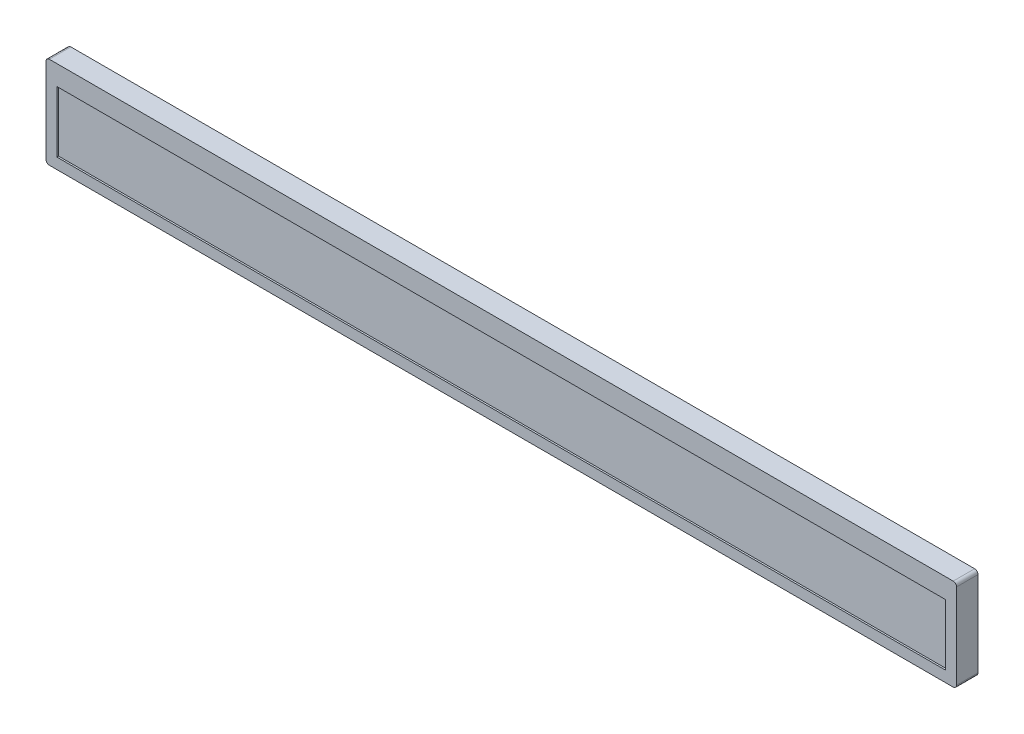
ISO-10303-21;
HEADER;
FILE_DESCRIPTION(('STEP AP214'),'2;1');
FILE_NAME('part.step','',(''),(''),'','','');
FILE_SCHEMA(('AUTOMOTIVE_DESIGN { 1 0 10303 214 1 1 1 1 }'));
ENDSEC;
DATA;
#1=APPLICATION_CONTEXT('core data for automotive mechanical design processes');
#2=APPLICATION_PROTOCOL_DEFINITION('international standard','automotive_design',2000,#1);
#3=PRODUCT_CONTEXT('',#1,'mechanical');
#4=PRODUCT('Part','Part','',(#3));
#5=PRODUCT_RELATED_PRODUCT_CATEGORY('part','',(#4));
#6=PRODUCT_DEFINITION_FORMATION('','',#4);
#7=PRODUCT_DEFINITION_CONTEXT('part definition',#1,'design');
#8=PRODUCT_DEFINITION('design','',#6,#7);
#9=PRODUCT_DEFINITION_SHAPE('','',#8);
#10=(LENGTH_UNIT() NAMED_UNIT(*) SI_UNIT(.MILLI.,.METRE.));
#11=(NAMED_UNIT(*) PLANE_ANGLE_UNIT() SI_UNIT($,.RADIAN.));
#12=(NAMED_UNIT(*) SI_UNIT($,.STERADIAN.) SOLID_ANGLE_UNIT());
#13=UNCERTAINTY_MEASURE_WITH_UNIT(LENGTH_MEASURE(1.E-05),#10,'distance_accuracy_value','');
#14=(GEOMETRIC_REPRESENTATION_CONTEXT(3) GLOBAL_UNCERTAINTY_ASSIGNED_CONTEXT((#13)) GLOBAL_UNIT_ASSIGNED_CONTEXT((#10,
#11,#12)) REPRESENTATION_CONTEXT('',''));
#15=CARTESIAN_POINT('',(0.,0.,0.));
#16=DIRECTION('',(0.,0.,1.));
#17=DIRECTION('',(1.,0.,0.));
#18=AXIS2_PLACEMENT_3D('',#15,#16,#17);
#19=CARTESIAN_POINT('',(269.21,25.35,0.));
#20=DIRECTION('',(0.,0.,-1.));
#21=DIRECTION('',(-1.,0.,0.));
#22=AXIS2_PLACEMENT_3D('',#19,#20,#21);
#23=PLANE('',#22);
#24=CARTESIAN_POINT('',(-253.41,4.02000000000001,0.));
#25=DIRECTION('',(0.,0.,-1.));
#26=DIRECTION('',(1.,0.,0.));
#27=AXIS2_PLACEMENT_3D('',#24,#25,#26);
#28=CIRCLE('',#27,2.50000000000002);
#29=CARTESIAN_POINT('',(-250.91,4.02000000000001,0.));
#30=VERTEX_POINT('',#29);
#31=EDGE_CURVE('E171',#30,#30,#28,.T.);
#32=ORIENTED_EDGE('',*,*,#31,.F.);
#33=EDGE_LOOP('',(#32));
#34=FACE_BOUND('',#33,.T.);
#35=CARTESIAN_POINT('',(-253.41,-10.06,0.));
#36=DIRECTION('',(0.,0.,-1.));
#37=DIRECTION('',(1.,0.,0.));
#38=AXIS2_PLACEMENT_3D('',#35,#36,#37);
#39=CIRCLE('',#38,2.50000000000002);
#40=CARTESIAN_POINT('',(-250.91,-10.06,0.));
#41=VERTEX_POINT('',#40);
#42=EDGE_CURVE('E180',#41,#41,#39,.T.);
#43=ORIENTED_EDGE('',*,*,#42,.F.);
#44=EDGE_LOOP('',(#43));
#45=FACE_BOUND('',#44,.T.);
#46=CARTESIAN_POINT('',(-113.,-10.06,0.));
#47=DIRECTION('',(0.,0.,-1.));
#48=DIRECTION('',(1.,0.,0.));
#49=AXIS2_PLACEMENT_3D('',#46,#47,#48);
#50=CIRCLE('',#49,2.5);
#51=CARTESIAN_POINT('',(-110.5,-10.06,0.));
#52=VERTEX_POINT('',#51);
#53=EDGE_CURVE('E185',#52,#52,#50,.T.);
#54=ORIENTED_EDGE('',*,*,#53,.F.);
#55=EDGE_LOOP('',(#54));
#56=FACE_BOUND('',#55,.T.);
#57=CARTESIAN_POINT('',(113.,-10.06,0.));
#58=DIRECTION('',(0.,0.,-1.));
#59=DIRECTION('',(-1.,0.,0.));
#60=AXIS2_PLACEMENT_3D('',#57,#58,#59);
#61=CIRCLE('',#60,2.5);
#62=CARTESIAN_POINT('',(110.5,-10.06,0.));
#63=VERTEX_POINT('',#62);
#64=EDGE_CURVE('E191',#63,#63,#61,.T.);
#65=ORIENTED_EDGE('',*,*,#64,.F.);
#66=EDGE_LOOP('',(#65));
#67=FACE_BOUND('',#66,.T.);
#68=CARTESIAN_POINT('',(253.41,-10.06,0.));
#69=DIRECTION('',(0.,0.,-1.));
#70=DIRECTION('',(-1.,0.,0.));
#71=AXIS2_PLACEMENT_3D('',#68,#69,#70);
#72=CIRCLE('',#71,2.50000000000002);
#73=CARTESIAN_POINT('',(250.91,-10.06,0.));
#74=VERTEX_POINT('',#73);
#75=EDGE_CURVE('E197',#74,#74,#72,.T.);
#76=ORIENTED_EDGE('',*,*,#75,.F.);
#77=EDGE_LOOP('',(#76));
#78=FACE_BOUND('',#77,.T.);
#79=CARTESIAN_POINT('',(253.41,4.02000000000001,0.));
#80=DIRECTION('',(0.,0.,-1.));
#81=DIRECTION('',(-1.,0.,0.));
#82=AXIS2_PLACEMENT_3D('',#79,#80,#81);
#83=CIRCLE('',#82,2.50000000000002);
#84=CARTESIAN_POINT('',(250.91,4.02000000000001,0.));
#85=VERTEX_POINT('',#84);
#86=EDGE_CURVE('E203',#85,#85,#83,.T.);
#87=ORIENTED_EDGE('',*,*,#86,.F.);
#88=EDGE_LOOP('',(#87));
#89=FACE_BOUND('',#88,.T.);
#90=DIRECTION('',(1.,0.,0.));
#91=VECTOR('',#90,1.);
#92=CARTESIAN_POINT('',(-269.21,-27.35,0.));
#93=LINE('',#92,#91);
#94=CARTESIAN_POINT('',(17.16,-27.35,0.));
#95=VERTEX_POINT('',#94);
#96=CARTESIAN_POINT('',(269.21,-27.35,0.));
#97=VERTEX_POINT('',#96);
#98=EDGE_CURVE('E271',#95,#97,#93,.T.);
#99=ORIENTED_EDGE('',*,*,#98,.F.);
#100=DIRECTION('',(0.,-1.,0.));
#101=VECTOR('',#100,1.);
#102=CARTESIAN_POINT('',(17.16,-12.47,0.));
#103=LINE('',#102,#101);
#104=CARTESIAN_POINT('',(17.16,-12.47,0.));
#105=VERTEX_POINT('',#104);
#106=EDGE_CURVE('E169',#105,#95,#103,.T.);
#107=ORIENTED_EDGE('',*,*,#106,.F.);
#108=DIRECTION('',(1.,0.,0.));
#109=VECTOR('',#108,1.);
#110=CARTESIAN_POINT('',(17.16,-12.47,0.));
#111=LINE('',#110,#109);
#112=CARTESIAN_POINT('',(-17.16,-12.47,0.));
#113=VERTEX_POINT('',#112);
#114=EDGE_CURVE('E165',#113,#105,#111,.T.);
#115=ORIENTED_EDGE('',*,*,#114,.F.);
#116=DIRECTION('',(0.,1.,0.));
#117=VECTOR('',#116,1.);
#118=CARTESIAN_POINT('',(-17.16,-12.47,0.));
#119=LINE('',#118,#117);
#120=CARTESIAN_POINT('',(-17.16,-27.35,0.));
#121=VERTEX_POINT('',#120);
#122=EDGE_CURVE('E334',#121,#113,#119,.T.);
#123=ORIENTED_EDGE('',*,*,#122,.F.);
#124=CARTESIAN_POINT('',(-269.21,-27.35,0.));
#125=VERTEX_POINT('',#124);
#126=EDGE_CURVE('E272',#125,#121,#93,.T.);
#127=ORIENTED_EDGE('',*,*,#126,.F.);
#128=CARTESIAN_POINT('',(-269.21,-25.35,0.));
#129=DIRECTION('',(0.,0.,1.));
#130=DIRECTION('',(1.,0.,0.));
#131=AXIS2_PLACEMENT_3D('',#128,#129,#130);
#132=CIRCLE('',#131,2.);
#133=CARTESIAN_POINT('',(-271.21,-25.35,0.));
#134=VERTEX_POINT('',#133);
#135=EDGE_CURVE('E269',#134,#125,#132,.T.);
#136=ORIENTED_EDGE('',*,*,#135,.F.);
#137=DIRECTION('',(0.,-1.,0.));
#138=VECTOR('',#137,1.);
#139=CARTESIAN_POINT('',(-271.21,25.35,0.));
#140=LINE('',#139,#138);
#141=CARTESIAN_POINT('',(-271.21,25.35,0.));
#142=VERTEX_POINT('',#141);
#143=EDGE_CURVE('E267',#142,#134,#140,.T.);
#144=ORIENTED_EDGE('',*,*,#143,.F.);
#145=CARTESIAN_POINT('',(-269.21,25.35,0.));
#146=DIRECTION('',(0.,0.,1.));
#147=DIRECTION('',(1.,0.,0.));
#148=AXIS2_PLACEMENT_3D('',#145,#146,#147);
#149=CIRCLE('',#148,2.);
#150=CARTESIAN_POINT('',(-269.21,27.35,0.));
#151=VERTEX_POINT('',#150);
#152=EDGE_CURVE('E265',#151,#142,#149,.T.);
#153=ORIENTED_EDGE('',*,*,#152,.F.);
#154=DIRECTION('',(-1.,0.,0.));
#155=VECTOR('',#154,1.);
#156=CARTESIAN_POINT('',(-269.21,27.35,0.));
#157=LINE('',#156,#155);
#158=CARTESIAN_POINT('',(269.21,27.35,0.));
#159=VERTEX_POINT('',#158);
#160=EDGE_CURVE('E263',#159,#151,#157,.T.);
#161=ORIENTED_EDGE('',*,*,#160,.F.);
#162=CARTESIAN_POINT('',(269.21,25.35,0.));
#163=DIRECTION('',(0.,0.,1.));
#164=DIRECTION('',(-1.,0.,0.));
#165=AXIS2_PLACEMENT_3D('',#162,#163,#164);
#166=CIRCLE('',#165,2.);
#167=CARTESIAN_POINT('',(271.21,25.35,0.));
#168=VERTEX_POINT('',#167);
#169=EDGE_CURVE('E236',#168,#159,#166,.T.);
#170=ORIENTED_EDGE('',*,*,#169,.F.);
#171=DIRECTION('',(0.,1.,0.));
#172=VECTOR('',#171,1.);
#173=CARTESIAN_POINT('',(271.21,25.35,0.));
#174=LINE('',#173,#172);
#175=CARTESIAN_POINT('',(271.21,-25.35,0.));
#176=VERTEX_POINT('',#175);
#177=EDGE_CURVE('E246',#176,#168,#174,.T.);
#178=ORIENTED_EDGE('',*,*,#177,.F.);
#179=CARTESIAN_POINT('',(269.21,-25.35,0.));
#180=DIRECTION('',(0.,0.,1.));
#181=DIRECTION('',(1.,0.,0.));
#182=AXIS2_PLACEMENT_3D('',#179,#180,#181);
#183=CIRCLE('',#182,2.);
#184=EDGE_CURVE('E274',#97,#176,#183,.T.);
#185=ORIENTED_EDGE('',*,*,#184,.F.);
#186=EDGE_LOOP('',(#99,#107,#115,#123,#127,#136,#144,#153,#161,#170,#178,#185));
#187=FACE_BOUND('',#186,.T.);
#188=ADVANCED_FACE('F33',(#34,#45,#56,#67,#78,#89,#187),#23,.T.);
#189=CARTESIAN_POINT('',(269.21,25.35,12.77));
#190=DIRECTION('',(0.,0.,-1.));
#191=DIRECTION('',(-1.,0.,0.));
#192=AXIS2_PLACEMENT_3D('',#189,#190,#191);
#193=CYLINDRICAL_SURFACE('',#192,2.);
#194=ORIENTED_EDGE('',*,*,#169,.T.);
#195=DIRECTION('',(0.,0.,-1.));
#196=VECTOR('',#195,1.);
#197=CARTESIAN_POINT('',(269.21,27.35,12.77));
#198=LINE('',#197,#196);
#199=CARTESIAN_POINT('',(269.21,27.35,12.77));
#200=VERTEX_POINT('',#199);
#201=EDGE_CURVE('E11',#200,#159,#198,.T.);
#202=ORIENTED_EDGE('',*,*,#201,.F.);
#203=CARTESIAN_POINT('',(269.21,25.35,12.77));
#204=DIRECTION('',(0.,0.,1.));
#205=DIRECTION('',(-1.,0.,0.));
#206=AXIS2_PLACEMENT_3D('',#203,#204,#205);
#207=CIRCLE('',#206,2.);
#208=CARTESIAN_POINT('',(271.21,25.35,12.77));
#209=VERTEX_POINT('',#208);
#210=EDGE_CURVE('E242',#209,#200,#207,.T.);
#211=ORIENTED_EDGE('',*,*,#210,.F.);
#212=DIRECTION('',(0.,0.,-1.));
#213=VECTOR('',#212,1.);
#214=CARTESIAN_POINT('',(271.21,25.35,12.77));
#215=LINE('',#214,#213);
#216=EDGE_CURVE('E260',#209,#168,#215,.T.);
#217=ORIENTED_EDGE('',*,*,#216,.T.);
#218=EDGE_LOOP('',(#194,#202,#211,#217));
#219=FACE_BOUND('',#218,.T.);
#220=ADVANCED_FACE('F35',(#219),#193,.T.);
#221=CARTESIAN_POINT('',(-269.21,27.35,12.77));
#222=DIRECTION('',(0.,-1.,0.));
#223=DIRECTION('',(0.,0.,-1.));
#224=AXIS2_PLACEMENT_3D('',#221,#222,#223);
#225=PLANE('',#224);
#226=ORIENTED_EDGE('',*,*,#160,.T.);
#227=DIRECTION('',(0.,0.,-1.));
#228=VECTOR('',#227,1.);
#229=CARTESIAN_POINT('',(-269.21,27.35,12.77));
#230=LINE('',#229,#228);
#231=CARTESIAN_POINT('',(-269.21,27.35,12.77));
#232=VERTEX_POINT('',#231);
#233=EDGE_CURVE('E41',#232,#151,#230,.T.);
#234=ORIENTED_EDGE('',*,*,#233,.F.);
#235=DIRECTION('',(-1.,0.,0.));
#236=VECTOR('',#235,1.);
#237=CARTESIAN_POINT('',(-269.21,27.35,12.77));
#238=LINE('',#237,#236);
#239=EDGE_CURVE('E245',#200,#232,#238,.T.);
#240=ORIENTED_EDGE('',*,*,#239,.F.);
#241=ORIENTED_EDGE('',*,*,#201,.T.);
#242=EDGE_LOOP('',(#226,#234,#240,#241));
#243=FACE_BOUND('',#242,.T.);
#244=ADVANCED_FACE('F320',(#243),#225,.F.);
#245=CARTESIAN_POINT('',(-269.21,25.35,12.77));
#246=DIRECTION('',(0.,0.,-1.));
#247=DIRECTION('',(-1.,0.,0.));
#248=AXIS2_PLACEMENT_3D('',#245,#246,#247);
#249=CYLINDRICAL_SURFACE('',#248,2.);
#250=ORIENTED_EDGE('',*,*,#152,.T.);
#251=DIRECTION('',(0.,0.,-1.));
#252=VECTOR('',#251,1.);
#253=CARTESIAN_POINT('',(-271.21,25.35,12.77));
#254=LINE('',#253,#252);
#255=CARTESIAN_POINT('',(-271.21,25.35,12.77));
#256=VERTEX_POINT('',#255);
#257=EDGE_CURVE('E291',#256,#142,#254,.T.);
#258=ORIENTED_EDGE('',*,*,#257,.F.);
#259=CARTESIAN_POINT('',(-269.21,25.35,12.77));
#260=DIRECTION('',(0.,0.,1.));
#261=DIRECTION('',(1.,0.,0.));
#262=AXIS2_PLACEMENT_3D('',#259,#260,#261);
#263=CIRCLE('',#262,2.);
#264=EDGE_CURVE('E248',#232,#256,#263,.T.);
#265=ORIENTED_EDGE('',*,*,#264,.F.);
#266=ORIENTED_EDGE('',*,*,#233,.T.);
#267=EDGE_LOOP('',(#250,#258,#265,#266));
#268=FACE_BOUND('',#267,.T.);
#269=ADVANCED_FACE('F298',(#268),#249,.T.);
#270=CARTESIAN_POINT('',(-271.21,25.35,12.77));
#271=DIRECTION('',(1.,0.,0.));
#272=DIRECTION('',(0.,0.,-1.));
#273=AXIS2_PLACEMENT_3D('',#270,#271,#272);
#274=PLANE('',#273);
#275=ORIENTED_EDGE('',*,*,#143,.T.);
#276=DIRECTION('',(0.,0.,-1.));
#277=VECTOR('',#276,1.);
#278=CARTESIAN_POINT('',(-271.21,-25.35,12.77));
#279=LINE('',#278,#277);
#280=CARTESIAN_POINT('',(-271.21,-25.35,12.77));
#281=VERTEX_POINT('',#280);
#282=EDGE_CURVE('E288',#281,#134,#279,.T.);
#283=ORIENTED_EDGE('',*,*,#282,.F.);
#284=DIRECTION('',(0.,-1.,0.));
#285=VECTOR('',#284,1.);
#286=CARTESIAN_POINT('',(-271.21,25.35,12.77));
#287=LINE('',#286,#285);
#288=EDGE_CURVE('E250',#256,#281,#287,.T.);
#289=ORIENTED_EDGE('',*,*,#288,.F.);
#290=ORIENTED_EDGE('',*,*,#257,.T.);
#291=EDGE_LOOP('',(#275,#283,#289,#290));
#292=FACE_BOUND('',#291,.T.);
#293=ADVANCED_FACE('F308',(#292),#274,.F.);
#294=CARTESIAN_POINT('',(-269.21,-25.35,12.77));
#295=DIRECTION('',(0.,0.,-1.));
#296=DIRECTION('',(-1.,0.,0.));
#297=AXIS2_PLACEMENT_3D('',#294,#295,#296);
#298=CYLINDRICAL_SURFACE('',#297,2.);
#299=ORIENTED_EDGE('',*,*,#135,.T.);
#300=DIRECTION('',(0.,0.,-1.));
#301=VECTOR('',#300,1.);
#302=CARTESIAN_POINT('',(-269.21,-27.35,12.77));
#303=LINE('',#302,#301);
#304=CARTESIAN_POINT('',(-269.21,-27.35,12.77));
#305=VERTEX_POINT('',#304);
#306=EDGE_CURVE('E285',#305,#125,#303,.T.);
#307=ORIENTED_EDGE('',*,*,#306,.F.);
#308=CARTESIAN_POINT('',(-269.21,-25.35,12.77));
#309=DIRECTION('',(0.,0.,1.));
#310=DIRECTION('',(1.,0.,0.));
#311=AXIS2_PLACEMENT_3D('',#308,#309,#310);
#312=CIRCLE('',#311,2.);
#313=EDGE_CURVE('E252',#281,#305,#312,.T.);
#314=ORIENTED_EDGE('',*,*,#313,.F.);
#315=ORIENTED_EDGE('',*,*,#282,.T.);
#316=EDGE_LOOP('',(#299,#307,#314,#315));
#317=FACE_BOUND('',#316,.T.);
#318=ADVANCED_FACE('F312',(#317),#298,.T.);
#319=CARTESIAN_POINT('',(-269.21,-27.35,12.77));
#320=DIRECTION('',(0.,1.,0.));
#321=DIRECTION('',(0.,0.,1.));
#322=AXIS2_PLACEMENT_3D('',#319,#320,#321);
#323=PLANE('',#322);
#324=ORIENTED_EDGE('',*,*,#126,.T.);
#325=DIRECTION('',(0.,0.,1.));
#326=VECTOR('',#325,1.);
#327=CARTESIAN_POINT('',(-17.16,-27.35,-1.25));
#328=LINE('',#327,#326);
#329=CARTESIAN_POINT('',(-17.16,-27.35,-1.25));
#330=VERTEX_POINT('',#329);
#331=EDGE_CURVE('E153',#330,#121,#328,.T.);
#332=ORIENTED_EDGE('',*,*,#331,.F.);
#333=DIRECTION('',(-1.,0.,0.));
#334=VECTOR('',#333,1.);
#335=CARTESIAN_POINT('',(17.16,-27.35,-1.25));
#336=LINE('',#335,#334);
#337=CARTESIAN_POINT('',(17.16,-27.35,-1.25));
#338=VERTEX_POINT('',#337);
#339=EDGE_CURVE('E146',#338,#330,#336,.T.);
#340=ORIENTED_EDGE('',*,*,#339,.F.);
#341=DIRECTION('',(0.,0.,1.));
#342=VECTOR('',#341,1.);
#343=CARTESIAN_POINT('',(17.16,-27.35,-1.25));
#344=LINE('',#343,#342);
#345=EDGE_CURVE('E151',#338,#95,#344,.T.);
#346=ORIENTED_EDGE('',*,*,#345,.T.);
#347=ORIENTED_EDGE('',*,*,#98,.T.);
#348=DIRECTION('',(0.,0.,-1.));
#349=VECTOR('',#348,1.);
#350=CARTESIAN_POINT('',(269.21,-27.35,12.77));
#351=LINE('',#350,#349);
#352=CARTESIAN_POINT('',(269.21,-27.35,12.77));
#353=VERTEX_POINT('',#352);
#354=EDGE_CURVE('E282',#353,#97,#351,.T.);
#355=ORIENTED_EDGE('',*,*,#354,.F.);
#356=DIRECTION('',(1.,0.,0.));
#357=VECTOR('',#356,1.);
#358=CARTESIAN_POINT('',(-269.21,-27.35,12.77));
#359=LINE('',#358,#357);
#360=EDGE_CURVE('E254',#305,#353,#359,.T.);
#361=ORIENTED_EDGE('',*,*,#360,.F.);
#362=ORIENTED_EDGE('',*,*,#306,.T.);
#363=EDGE_LOOP('',(#324,#332,#340,#346,#347,#355,#361,#362));
#364=FACE_BOUND('',#363,.T.);
#365=ADVANCED_FACE('F149',(#364),#323,.F.);
#366=CARTESIAN_POINT('',(269.21,-25.35,12.77));
#367=DIRECTION('',(0.,0.,-1.));
#368=DIRECTION('',(-1.,0.,0.));
#369=AXIS2_PLACEMENT_3D('',#366,#367,#368);
#370=CYLINDRICAL_SURFACE('',#369,2.);
#371=ORIENTED_EDGE('',*,*,#184,.T.);
#372=DIRECTION('',(0.,0.,-1.));
#373=VECTOR('',#372,1.);
#374=CARTESIAN_POINT('',(271.21,-25.35,12.77));
#375=LINE('',#374,#373);
#376=CARTESIAN_POINT('',(271.21,-25.35,12.77));
#377=VERTEX_POINT('',#376);
#378=EDGE_CURVE('E279',#377,#176,#375,.T.);
#379=ORIENTED_EDGE('',*,*,#378,.F.);
#380=CARTESIAN_POINT('',(269.21,-25.35,12.77));
#381=DIRECTION('',(0.,0.,1.));
#382=DIRECTION('',(1.,0.,0.));
#383=AXIS2_PLACEMENT_3D('',#380,#381,#382);
#384=CIRCLE('',#383,2.);
#385=EDGE_CURVE('E256',#353,#377,#384,.T.);
#386=ORIENTED_EDGE('',*,*,#385,.F.);
#387=ORIENTED_EDGE('',*,*,#354,.T.);
#388=EDGE_LOOP('',(#371,#379,#386,#387));
#389=FACE_BOUND('',#388,.T.);
#390=ADVANCED_FACE('F331',(#389),#370,.T.);
#391=CARTESIAN_POINT('',(271.21,25.35,12.77));
#392=DIRECTION('',(-1.,0.,0.));
#393=DIRECTION('',(0.,0.,1.));
#394=AXIS2_PLACEMENT_3D('',#391,#392,#393);
#395=PLANE('',#394);
#396=ORIENTED_EDGE('',*,*,#177,.T.);
#397=ORIENTED_EDGE('',*,*,#216,.F.);
#398=DIRECTION('',(0.,1.,0.));
#399=VECTOR('',#398,1.);
#400=CARTESIAN_POINT('',(271.21,25.35,12.77));
#401=LINE('',#400,#399);
#402=EDGE_CURVE('E258',#377,#209,#401,.T.);
#403=ORIENTED_EDGE('',*,*,#402,.F.);
#404=ORIENTED_EDGE('',*,*,#378,.T.);
#405=EDGE_LOOP('',(#396,#397,#403,#404));
#406=FACE_BOUND('',#405,.T.);
#407=ADVANCED_FACE('F326',(#406),#395,.F.);
#408=CARTESIAN_POINT('',(269.21,25.35,12.77));
#409=DIRECTION('',(0.,0.,-1.));
#410=DIRECTION('',(-1.,0.,0.));
#411=AXIS2_PLACEMENT_3D('',#408,#409,#410);
#412=PLANE('',#411);
#413=DIRECTION('',(1.,0.,0.));
#414=VECTOR('',#413,1.);
#415=CARTESIAN_POINT('',(264.71,-20.87,12.77));
#416=LINE('',#415,#414);
#417=CARTESIAN_POINT('',(-264.71,-20.8700000000001,12.77));
#418=VERTEX_POINT('',#417);
#419=CARTESIAN_POINT('',(264.71,-20.87,12.77));
#420=VERTEX_POINT('',#419);
#421=EDGE_CURVE('E226',#418,#420,#416,.T.);
#422=ORIENTED_EDGE('',*,*,#421,.F.);
#423=DIRECTION('',(0.,-1.,0.));
#424=VECTOR('',#423,1.);
#425=CARTESIAN_POINT('',(-264.71,15.5299999999999,12.77));
#426=LINE('',#425,#424);
#427=CARTESIAN_POINT('',(-264.71,15.5299999999999,12.77));
#428=VERTEX_POINT('',#427);
#429=EDGE_CURVE('E56',#428,#418,#426,.T.);
#430=ORIENTED_EDGE('',*,*,#429,.F.);
#431=DIRECTION('',(-1.,0.,0.));
#432=VECTOR('',#431,1.);
#433=CARTESIAN_POINT('',(264.71,15.53,12.77));
#434=LINE('',#433,#432);
#435=CARTESIAN_POINT('',(264.71,15.53,12.77));
#436=VERTEX_POINT('',#435);
#437=EDGE_CURVE('E215',#436,#428,#434,.T.);
#438=ORIENTED_EDGE('',*,*,#437,.F.);
#439=DIRECTION('',(0.,1.,0.));
#440=VECTOR('',#439,1.);
#441=CARTESIAN_POINT('',(264.71,15.53,12.77));
#442=LINE('',#441,#440);
#443=EDGE_CURVE('E229',#420,#436,#442,.T.);
#444=ORIENTED_EDGE('',*,*,#443,.F.);
#445=EDGE_LOOP('',(#422,#430,#438,#444));
#446=FACE_BOUND('',#445,.T.);
#447=ORIENTED_EDGE('',*,*,#210,.T.);
#448=ORIENTED_EDGE('',*,*,#239,.T.);
#449=ORIENTED_EDGE('',*,*,#264,.T.);
#450=ORIENTED_EDGE('',*,*,#288,.T.);
#451=ORIENTED_EDGE('',*,*,#313,.T.);
#452=ORIENTED_EDGE('',*,*,#360,.T.);
#453=ORIENTED_EDGE('',*,*,#385,.T.);
#454=ORIENTED_EDGE('',*,*,#402,.T.);
#455=EDGE_LOOP('',(#447,#448,#449,#450,#451,#452,#453,#454));
#456=FACE_BOUND('',#455,.T.);
#457=ADVANCED_FACE('F316',(#446,#456),#412,.F.);
#458=CARTESIAN_POINT('',(-264.71,15.5299999999999,11.77));
#459=DIRECTION('',(-1.,0.,0.));
#460=DIRECTION('',(0.,0.,1.));
#461=AXIS2_PLACEMENT_3D('',#458,#459,#460);
#462=PLANE('',#461);
#463=ORIENTED_EDGE('',*,*,#429,.T.);
#464=DIRECTION('',(0.,0.,1.));
#465=VECTOR('',#464,1.);
#466=CARTESIAN_POINT('',(-264.71,-20.8700000000001,11.77));
#467=LINE('',#466,#465);
#468=CARTESIAN_POINT('',(-264.71,-20.8700000000001,11.77));
#469=VERTEX_POINT('',#468);
#470=EDGE_CURVE('E224',#469,#418,#467,.T.);
#471=ORIENTED_EDGE('',*,*,#470,.F.);
#472=DIRECTION('',(0.,-1.,0.));
#473=VECTOR('',#472,1.);
#474=CARTESIAN_POINT('',(-264.71,15.5299999999999,11.77));
#475=LINE('',#474,#473);
#476=CARTESIAN_POINT('',(-264.71,15.5299999999999,11.77));
#477=VERTEX_POINT('',#476);
#478=EDGE_CURVE('E211',#477,#469,#475,.T.);
#479=ORIENTED_EDGE('',*,*,#478,.F.);
#480=DIRECTION('',(0.,0.,1.));
#481=VECTOR('',#480,1.);
#482=CARTESIAN_POINT('',(-264.71,15.5299999999999,11.77));
#483=LINE('',#482,#481);
#484=EDGE_CURVE('E234',#477,#428,#483,.T.);
#485=ORIENTED_EDGE('',*,*,#484,.T.);
#486=EDGE_LOOP('',(#463,#471,#479,#485));
#487=FACE_BOUND('',#486,.T.);
#488=ADVANCED_FACE('F411',(#487),#462,.F.);
#489=CARTESIAN_POINT('',(264.71,15.53,11.77));
#490=DIRECTION('',(0.,1.,0.));
#491=DIRECTION('',(-1.,0.,0.));
#492=AXIS2_PLACEMENT_3D('',#489,#490,#491);
#493=PLANE('',#492);
#494=ORIENTED_EDGE('',*,*,#437,.T.);
#495=ORIENTED_EDGE('',*,*,#484,.F.);
#496=DIRECTION('',(-1.,0.,0.));
#497=VECTOR('',#496,1.);
#498=CARTESIAN_POINT('',(264.71,15.53,11.77));
#499=LINE('',#498,#497);
#500=CARTESIAN_POINT('',(264.71,15.53,11.77));
#501=VERTEX_POINT('',#500);
#502=EDGE_CURVE('E221',#501,#477,#499,.T.);
#503=ORIENTED_EDGE('',*,*,#502,.F.);
#504=DIRECTION('',(0.,0.,1.));
#505=VECTOR('',#504,1.);
#506=CARTESIAN_POINT('',(264.71,15.53,11.77));
#507=LINE('',#506,#505);
#508=EDGE_CURVE('E237',#501,#436,#507,.T.);
#509=ORIENTED_EDGE('',*,*,#508,.T.);
#510=EDGE_LOOP('',(#494,#495,#503,#509));
#511=FACE_BOUND('',#510,.T.);
#512=ADVANCED_FACE('F418',(#511),#493,.F.);
#513=CARTESIAN_POINT('',(264.71,15.53,11.77));
#514=DIRECTION('',(1.,0.,0.));
#515=DIRECTION('',(0.,0.,-1.));
#516=AXIS2_PLACEMENT_3D('',#513,#514,#515);
#517=PLANE('',#516);
#518=ORIENTED_EDGE('',*,*,#443,.T.);
#519=ORIENTED_EDGE('',*,*,#508,.F.);
#520=DIRECTION('',(0.,1.,0.));
#521=VECTOR('',#520,1.);
#522=CARTESIAN_POINT('',(264.71,15.53,11.77));
#523=LINE('',#522,#521);
#524=CARTESIAN_POINT('',(264.71,-20.87,11.77));
#525=VERTEX_POINT('',#524);
#526=EDGE_CURVE('E218',#525,#501,#523,.T.);
#527=ORIENTED_EDGE('',*,*,#526,.F.);
#528=DIRECTION('',(0.,0.,1.));
#529=VECTOR('',#528,1.);
#530=CARTESIAN_POINT('',(264.71,-20.87,11.77));
#531=LINE('',#530,#529);
#532=EDGE_CURVE('E239',#525,#420,#531,.T.);
#533=ORIENTED_EDGE('',*,*,#532,.T.);
#534=EDGE_LOOP('',(#518,#519,#527,#533));
#535=FACE_BOUND('',#534,.T.);
#536=ADVANCED_FACE('F424',(#535),#517,.F.);
#537=CARTESIAN_POINT('',(264.71,-20.87,11.77));
#538=DIRECTION('',(0.,-1.,0.));
#539=DIRECTION('',(1.,0.,0.));
#540=AXIS2_PLACEMENT_3D('',#537,#538,#539);
#541=PLANE('',#540);
#542=ORIENTED_EDGE('',*,*,#421,.T.);
#543=ORIENTED_EDGE('',*,*,#532,.F.);
#544=DIRECTION('',(1.,0.,0.));
#545=VECTOR('',#544,1.);
#546=CARTESIAN_POINT('',(264.71,-20.87,11.77));
#547=LINE('',#546,#545);
#548=EDGE_CURVE('E214',#469,#525,#547,.T.);
#549=ORIENTED_EDGE('',*,*,#548,.F.);
#550=ORIENTED_EDGE('',*,*,#470,.T.);
#551=EDGE_LOOP('',(#542,#543,#549,#550));
#552=FACE_BOUND('',#551,.T.);
#553=ADVANCED_FACE('F432',(#552),#541,.F.);
#554=CARTESIAN_POINT('',(0.,0.,11.77));
#555=DIRECTION('',(0.,0.,-1.));
#556=DIRECTION('',(-1.,0.,0.));
#557=AXIS2_PLACEMENT_3D('',#554,#555,#556);
#558=PLANE('',#557);
#559=ORIENTED_EDGE('',*,*,#478,.T.);
#560=ORIENTED_EDGE('',*,*,#548,.T.);
#561=ORIENTED_EDGE('',*,*,#526,.T.);
#562=ORIENTED_EDGE('',*,*,#502,.T.);
#563=EDGE_LOOP('',(#559,#560,#561,#562));
#564=FACE_BOUND('',#563,.T.);
#565=ADVANCED_FACE('F440',(#564),#558,.F.);
#566=CARTESIAN_POINT('',(253.41,4.02000000000001,-1.25));
#567=DIRECTION('',(0.,0.,1.));
#568=DIRECTION('',(1.,0.,0.));
#569=AXIS2_PLACEMENT_3D('',#566,#567,#568);
#570=CYLINDRICAL_SURFACE('',#569,2.50000000000002);
#571=CARTESIAN_POINT('',(253.41,4.02000000000001,-1.25));
#572=DIRECTION('',(0.,0.,-1.));
#573=DIRECTION('',(-1.,0.,0.));
#574=AXIS2_PLACEMENT_3D('',#571,#572,#573);
#575=CIRCLE('',#574,2.50000000000002);
#576=CARTESIAN_POINT('',(250.91,4.02000000000001,-1.25));
#577=VERTEX_POINT('',#576);
#578=EDGE_CURVE('E206',#577,#577,#575,.T.);
#579=ORIENTED_EDGE('',*,*,#578,.F.);
#580=EDGE_LOOP('',(#579));
#581=FACE_BOUND('',#580,.T.);
#582=ORIENTED_EDGE('',*,*,#86,.T.);
#583=EDGE_LOOP('',(#582));
#584=FACE_BOUND('',#583,.T.);
#585=ADVANCED_FACE('F448',(#581,#584),#570,.T.);
#586=CARTESIAN_POINT('',(253.41,4.02000000000001,-1.25));
#587=DIRECTION('',(0.,0.,-1.));
#588=DIRECTION('',(-1.,0.,0.));
#589=AXIS2_PLACEMENT_3D('',#586,#587,#588);
#590=PLANE('',#589);
#591=ORIENTED_EDGE('',*,*,#578,.T.);
#592=EDGE_LOOP('',(#591));
#593=FACE_BOUND('',#592,.T.);
#594=ADVANCED_FACE('F455',(#593),#590,.T.);
#595=CARTESIAN_POINT('',(253.41,-10.06,-1.25));
#596=DIRECTION('',(0.,0.,1.));
#597=DIRECTION('',(1.,0.,0.));
#598=AXIS2_PLACEMENT_3D('',#595,#596,#597);
#599=CYLINDRICAL_SURFACE('',#598,2.50000000000002);
#600=CARTESIAN_POINT('',(253.41,-10.06,-1.25));
#601=DIRECTION('',(0.,0.,-1.));
#602=DIRECTION('',(-1.,0.,0.));
#603=AXIS2_PLACEMENT_3D('',#600,#601,#602);
#604=CIRCLE('',#603,2.50000000000002);
#605=CARTESIAN_POINT('',(250.91,-10.06,-1.25));
#606=VERTEX_POINT('',#605);
#607=EDGE_CURVE('E200',#606,#606,#604,.T.);
#608=ORIENTED_EDGE('',*,*,#607,.F.);
#609=EDGE_LOOP('',(#608));
#610=FACE_BOUND('',#609,.T.);
#611=ORIENTED_EDGE('',*,*,#75,.T.);
#612=EDGE_LOOP('',(#611));
#613=FACE_BOUND('',#612,.T.);
#614=ADVANCED_FACE('F463',(#610,#613),#599,.T.);
#615=CARTESIAN_POINT('',(253.41,-10.06,-1.25));
#616=DIRECTION('',(0.,0.,-1.));
#617=DIRECTION('',(-1.,0.,0.));
#618=AXIS2_PLACEMENT_3D('',#615,#616,#617);
#619=PLANE('',#618);
#620=ORIENTED_EDGE('',*,*,#607,.T.);
#621=EDGE_LOOP('',(#620));
#622=FACE_BOUND('',#621,.T.);
#623=ADVANCED_FACE('F471',(#622),#619,.T.);
#624=CARTESIAN_POINT('',(113.,-10.06,-1.25));
#625=DIRECTION('',(0.,0.,1.));
#626=DIRECTION('',(1.,0.,0.));
#627=AXIS2_PLACEMENT_3D('',#624,#625,#626);
#628=CYLINDRICAL_SURFACE('',#627,2.5);
#629=CARTESIAN_POINT('',(113.,-10.06,-1.25));
#630=DIRECTION('',(0.,0.,-1.));
#631=DIRECTION('',(-1.,0.,0.));
#632=AXIS2_PLACEMENT_3D('',#629,#630,#631);
#633=CIRCLE('',#632,2.5);
#634=CARTESIAN_POINT('',(110.5,-10.06,-1.25));
#635=VERTEX_POINT('',#634);
#636=EDGE_CURVE('E194',#635,#635,#633,.T.);
#637=ORIENTED_EDGE('',*,*,#636,.F.);
#638=EDGE_LOOP('',(#637));
#639=FACE_BOUND('',#638,.T.);
#640=ORIENTED_EDGE('',*,*,#64,.T.);
#641=EDGE_LOOP('',(#640));
#642=FACE_BOUND('',#641,.T.);
#643=ADVANCED_FACE('F479',(#639,#642),#628,.T.);
#644=CARTESIAN_POINT('',(113.,-10.06,-1.25));
#645=DIRECTION('',(0.,0.,-1.));
#646=DIRECTION('',(-1.,0.,0.));
#647=AXIS2_PLACEMENT_3D('',#644,#645,#646);
#648=PLANE('',#647);
#649=ORIENTED_EDGE('',*,*,#636,.T.);
#650=EDGE_LOOP('',(#649));
#651=FACE_BOUND('',#650,.T.);
#652=ADVANCED_FACE('F487',(#651),#648,.T.);
#653=CARTESIAN_POINT('',(-113.,-10.06,-1.25));
#654=DIRECTION('',(0.,0.,1.));
#655=DIRECTION('',(1.,0.,0.));
#656=AXIS2_PLACEMENT_3D('',#653,#654,#655);
#657=CYLINDRICAL_SURFACE('',#656,2.5);
#658=CARTESIAN_POINT('',(-113.,-10.06,-1.25));
#659=DIRECTION('',(0.,0.,-1.));
#660=DIRECTION('',(1.,0.,0.));
#661=AXIS2_PLACEMENT_3D('',#658,#659,#660);
#662=CIRCLE('',#661,2.5);
#663=CARTESIAN_POINT('',(-110.5,-10.06,-1.25));
#664=VERTEX_POINT('',#663);
#665=EDGE_CURVE('E188',#664,#664,#662,.T.);
#666=ORIENTED_EDGE('',*,*,#665,.F.);
#667=EDGE_LOOP('',(#666));
#668=FACE_BOUND('',#667,.T.);
#669=ORIENTED_EDGE('',*,*,#53,.T.);
#670=EDGE_LOOP('',(#669));
#671=FACE_BOUND('',#670,.T.);
#672=ADVANCED_FACE('F495',(#668,#671),#657,.T.);
#673=CARTESIAN_POINT('',(-113.,-10.06,-1.25));
#674=DIRECTION('',(0.,0.,1.));
#675=DIRECTION('',(1.,0.,0.));
#676=AXIS2_PLACEMENT_3D('',#673,#674,#675);
#677=PLANE('',#676);
#678=ORIENTED_EDGE('',*,*,#665,.T.);
#679=EDGE_LOOP('',(#678));
#680=FACE_BOUND('',#679,.T.);
#681=ADVANCED_FACE('F503',(#680),#677,.F.);
#682=CARTESIAN_POINT('',(-253.41,-10.06,-1.25));
#683=DIRECTION('',(0.,0.,1.));
#684=DIRECTION('',(1.,0.,0.));
#685=AXIS2_PLACEMENT_3D('',#682,#683,#684);
#686=CYLINDRICAL_SURFACE('',#685,2.50000000000002);
#687=CARTESIAN_POINT('',(-253.41,-10.06,-1.25));
#688=DIRECTION('',(0.,0.,-1.));
#689=DIRECTION('',(1.,0.,0.));
#690=AXIS2_PLACEMENT_3D('',#687,#688,#689);
#691=CIRCLE('',#690,2.50000000000002);
#692=CARTESIAN_POINT('',(-250.91,-10.06,-1.25));
#693=VERTEX_POINT('',#692);
#694=EDGE_CURVE('E182',#693,#693,#691,.T.);
#695=ORIENTED_EDGE('',*,*,#694,.F.);
#696=EDGE_LOOP('',(#695));
#697=FACE_BOUND('',#696,.T.);
#698=ORIENTED_EDGE('',*,*,#42,.T.);
#699=EDGE_LOOP('',(#698));
#700=FACE_BOUND('',#699,.T.);
#701=ADVANCED_FACE('F511',(#697,#700),#686,.T.);
#702=CARTESIAN_POINT('',(-253.41,-10.06,-1.25));
#703=DIRECTION('',(0.,0.,1.));
#704=DIRECTION('',(1.,0.,0.));
#705=AXIS2_PLACEMENT_3D('',#702,#703,#704);
#706=PLANE('',#705);
#707=ORIENTED_EDGE('',*,*,#694,.T.);
#708=EDGE_LOOP('',(#707));
#709=FACE_BOUND('',#708,.T.);
#710=ADVANCED_FACE('F519',(#709),#706,.F.);
#711=CARTESIAN_POINT('',(-253.41,4.02000000000001,-1.25));
#712=DIRECTION('',(0.,0.,1.));
#713=DIRECTION('',(1.,0.,0.));
#714=AXIS2_PLACEMENT_3D('',#711,#712,#713);
#715=CYLINDRICAL_SURFACE('',#714,2.50000000000002);
#716=CARTESIAN_POINT('',(-253.41,4.02000000000001,-1.25));
#717=DIRECTION('',(0.,0.,-1.));
#718=DIRECTION('',(1.,0.,0.));
#719=AXIS2_PLACEMENT_3D('',#716,#717,#718);
#720=CIRCLE('',#719,2.50000000000002);
#721=CARTESIAN_POINT('',(-250.91,4.02000000000001,-1.25));
#722=VERTEX_POINT('',#721);
#723=EDGE_CURVE('E174',#722,#722,#720,.T.);
#724=ORIENTED_EDGE('',*,*,#723,.F.);
#725=EDGE_LOOP('',(#724));
#726=FACE_BOUND('',#725,.T.);
#727=ORIENTED_EDGE('',*,*,#31,.T.);
#728=EDGE_LOOP('',(#727));
#729=FACE_BOUND('',#728,.T.);
#730=ADVANCED_FACE('F527',(#726,#729),#715,.T.);
#731=CARTESIAN_POINT('',(-253.41,4.02000000000001,-1.25));
#732=DIRECTION('',(0.,0.,1.));
#733=DIRECTION('',(1.,0.,0.));
#734=AXIS2_PLACEMENT_3D('',#731,#732,#733);
#735=PLANE('',#734);
#736=ORIENTED_EDGE('',*,*,#723,.T.);
#737=EDGE_LOOP('',(#736));
#738=FACE_BOUND('',#737,.T.);
#739=ADVANCED_FACE('F535',(#738),#735,.F.);
#740=CARTESIAN_POINT('',(17.16,-12.47,-1.25));
#741=DIRECTION('',(-1.,0.,0.));
#742=DIRECTION('',(0.,-1.,0.));
#743=AXIS2_PLACEMENT_3D('',#740,#741,#742);
#744=PLANE('',#743);
#745=ORIENTED_EDGE('',*,*,#106,.T.);
#746=ORIENTED_EDGE('',*,*,#345,.F.);
#747=DIRECTION('',(0.,-1.,0.));
#748=VECTOR('',#747,1.);
#749=CARTESIAN_POINT('',(17.16,-12.47,-1.25));
#750=LINE('',#749,#748);
#751=CARTESIAN_POINT('',(17.16,-12.47,-1.25));
#752=VERTEX_POINT('',#751);
#753=EDGE_CURVE('E157',#752,#338,#750,.T.);
#754=ORIENTED_EDGE('',*,*,#753,.F.);
#755=DIRECTION('',(0.,0.,1.));
#756=VECTOR('',#755,1.);
#757=CARTESIAN_POINT('',(17.16,-12.47,-1.25));
#758=LINE('',#757,#756);
#759=EDGE_CURVE('E341',#752,#105,#758,.T.);
#760=ORIENTED_EDGE('',*,*,#759,.T.);
#761=EDGE_LOOP('',(#745,#746,#754,#760));
#762=FACE_BOUND('',#761,.T.);
#763=ADVANCED_FACE('F167',(#762),#744,.F.);
#764=CARTESIAN_POINT('',(-17.16,-12.47,-1.25));
#765=DIRECTION('',(1.,0.,0.));
#766=DIRECTION('',(0.,1.,0.));
#767=AXIS2_PLACEMENT_3D('',#764,#765,#766);
#768=PLANE('',#767);
#769=ORIENTED_EDGE('',*,*,#122,.T.);
#770=DIRECTION('',(0.,0.,1.));
#771=VECTOR('',#770,1.);
#772=CARTESIAN_POINT('',(-17.16,-12.47,-1.25));
#773=LINE('',#772,#771);
#774=CARTESIAN_POINT('',(-17.16,-12.47,-1.25));
#775=VERTEX_POINT('',#774);
#776=EDGE_CURVE('E48',#775,#113,#773,.T.);
#777=ORIENTED_EDGE('',*,*,#776,.F.);
#778=DIRECTION('',(0.,1.,0.));
#779=VECTOR('',#778,1.);
#780=CARTESIAN_POINT('',(-17.16,-12.47,-1.25));
#781=LINE('',#780,#779);
#782=EDGE_CURVE('E156',#330,#775,#781,.T.);
#783=ORIENTED_EDGE('',*,*,#782,.F.);
#784=ORIENTED_EDGE('',*,*,#331,.T.);
#785=EDGE_LOOP('',(#769,#777,#783,#784));
#786=FACE_BOUND('',#785,.T.);
#787=ADVANCED_FACE('F343',(#786),#768,.F.);
#788=CARTESIAN_POINT('',(17.16,-12.47,-1.25));
#789=DIRECTION('',(0.,-1.,0.));
#790=DIRECTION('',(1.,0.,0.));
#791=AXIS2_PLACEMENT_3D('',#788,#789,#790);
#792=PLANE('',#791);
#793=ORIENTED_EDGE('',*,*,#114,.T.);
#794=ORIENTED_EDGE('',*,*,#759,.F.);
#795=DIRECTION('',(1.,0.,0.));
#796=VECTOR('',#795,1.);
#797=CARTESIAN_POINT('',(17.16,-12.47,-1.25));
#798=LINE('',#797,#796);
#799=EDGE_CURVE('E161',#775,#752,#798,.T.);
#800=ORIENTED_EDGE('',*,*,#799,.F.);
#801=ORIENTED_EDGE('',*,*,#776,.T.);
#802=EDGE_LOOP('',(#793,#794,#800,#801));
#803=FACE_BOUND('',#802,.T.);
#804=ADVANCED_FACE('F344',(#803),#792,.F.);
#805=CARTESIAN_POINT('',(0.,0.,-1.25));
#806=DIRECTION('',(0.,0.,-1.));
#807=DIRECTION('',(-1.,0.,0.));
#808=AXIS2_PLACEMENT_3D('',#805,#806,#807);
#809=PLANE('',#808);
#810=ORIENTED_EDGE('',*,*,#753,.T.);
#811=ORIENTED_EDGE('',*,*,#339,.T.);
#812=ORIENTED_EDGE('',*,*,#782,.T.);
#813=ORIENTED_EDGE('',*,*,#799,.T.);
#814=EDGE_LOOP('',(#810,#811,#812,#813));
#815=FACE_BOUND('',#814,.T.);
#816=ADVANCED_FACE('F160',(#815),#809,.T.);
#817=CLOSED_SHELL('',(#188,#220,#244,#269,#293,#318,#365,#390,#407,#457,#488,#512,#536,#553,
#565,#585,#594,#614,#623,#643,#652,#672,#681,#701,#710,#730,#739,#763,#787,#804,#816));
#818=MANIFOLD_SOLID_BREP('B2',#817);
#819=ADVANCED_BREP_SHAPE_REPRESENTATION('',(#18,#818),#14);
#820=SHAPE_DEFINITION_REPRESENTATION(#9,#819);
ENDSEC;
END-ISO-10303-21;
